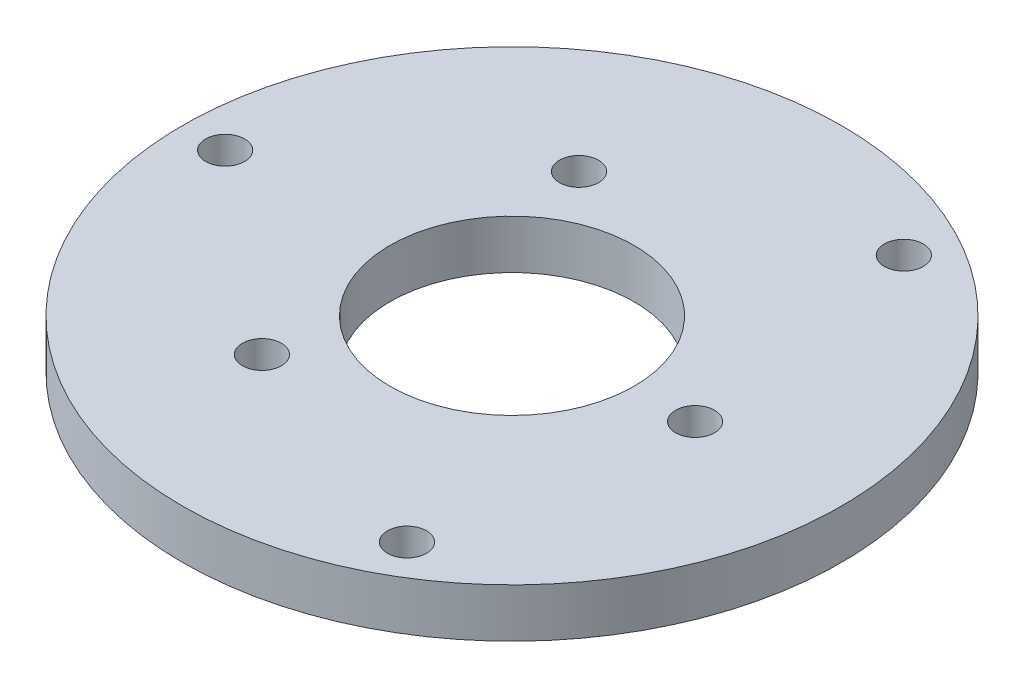
ISO-10303-21;
HEADER;
FILE_DESCRIPTION(('STEP AP214'),'2;1');
FILE_NAME('part.step','',(''),(''),'','','');
FILE_SCHEMA(('AUTOMOTIVE_DESIGN { 1 0 10303 214 1 1 1 1 }'));
ENDSEC;
DATA;
#1=APPLICATION_CONTEXT('core data for automotive mechanical design processes');
#2=APPLICATION_PROTOCOL_DEFINITION('international standard','automotive_design',2000,#1);
#3=PRODUCT_CONTEXT('',#1,'mechanical');
#4=PRODUCT('Part','Part','',(#3));
#5=PRODUCT_RELATED_PRODUCT_CATEGORY('part','',(#4));
#6=PRODUCT_DEFINITION_FORMATION('','',#4);
#7=PRODUCT_DEFINITION_CONTEXT('part definition',#1,'design');
#8=PRODUCT_DEFINITION('design','',#6,#7);
#9=PRODUCT_DEFINITION_SHAPE('','',#8);
#10=(LENGTH_UNIT() NAMED_UNIT(*) SI_UNIT(.MILLI.,.METRE.));
#11=(NAMED_UNIT(*) PLANE_ANGLE_UNIT() SI_UNIT($,.RADIAN.));
#12=(NAMED_UNIT(*) SI_UNIT($,.STERADIAN.) SOLID_ANGLE_UNIT());
#13=UNCERTAINTY_MEASURE_WITH_UNIT(LENGTH_MEASURE(1.E-05),#10,'distance_accuracy_value','');
#14=(GEOMETRIC_REPRESENTATION_CONTEXT(3) GLOBAL_UNCERTAINTY_ASSIGNED_CONTEXT((#13)) GLOBAL_UNIT_ASSIGNED_CONTEXT((#10,
#11,#12)) REPRESENTATION_CONTEXT('',''));
#15=CARTESIAN_POINT('',(0.,0.,0.));
#16=DIRECTION('',(0.,0.,1.));
#17=DIRECTION('',(1.,0.,0.));
#18=AXIS2_PLACEMENT_3D('',#15,#16,#17);
#19=CARTESIAN_POINT('',(0.,4.,0.));
#20=DIRECTION('',(0.,1.,0.));
#21=DIRECTION('',(0.,0.,1.));
#22=AXIS2_PLACEMENT_3D('',#19,#20,#21);
#23=PLANE('',#22);
#24=CARTESIAN_POINT('',(11.75,4.,-20.3515969889343));
#25=DIRECTION('',(0.,1.,0.));
#26=DIRECTION('',(0.,0.,1.));
#27=AXIS2_PLACEMENT_3D('',#24,#25,#26);
#28=CIRCLE('',#27,1.6);
#29=CARTESIAN_POINT('',(11.75,4.,-18.7515969889343));
#30=VERTEX_POINT('',#29);
#31=EDGE_CURVE('E55',#30,#30,#28,.T.);
#32=ORIENTED_EDGE('',*,*,#31,.F.);
#33=EDGE_LOOP('',(#32));
#34=FACE_BOUND('',#33,.T.);
#35=CARTESIAN_POINT('',(11.75,4.,20.3515969889343));
#36=DIRECTION('',(0.,1.,0.));
#37=DIRECTION('',(0.,0.,1.));
#38=AXIS2_PLACEMENT_3D('',#35,#36,#37);
#39=CIRCLE('',#38,1.6);
#40=CARTESIAN_POINT('',(11.75,4.,21.9515969889343));
#41=VERTEX_POINT('',#40);
#42=EDGE_CURVE('E116',#41,#41,#39,.T.);
#43=ORIENTED_EDGE('',*,*,#42,.F.);
#44=EDGE_LOOP('',(#43));
#45=FACE_BOUND('',#44,.T.);
#46=CARTESIAN_POINT('',(-23.5,4.,0.));
#47=DIRECTION('',(0.,1.,0.));
#48=DIRECTION('',(0.,0.,1.));
#49=AXIS2_PLACEMENT_3D('',#46,#47,#48);
#50=CIRCLE('',#49,1.6);
#51=CARTESIAN_POINT('',(-23.5,4.,1.60000000000001));
#52=VERTEX_POINT('',#51);
#53=EDGE_CURVE('E120',#52,#52,#50,.T.);
#54=ORIENTED_EDGE('',*,*,#53,.F.);
#55=EDGE_LOOP('',(#54));
#56=FACE_BOUND('',#55,.T.);
#57=CARTESIAN_POINT('',(-7.5,4.,12.9903810567666));
#58=DIRECTION('',(0.,1.,0.));
#59=DIRECTION('',(0.,0.,1.));
#60=AXIS2_PLACEMENT_3D('',#57,#58,#59);
#61=CIRCLE('',#60,1.6);
#62=CARTESIAN_POINT('',(-7.5,4.,14.5903810567666));
#63=VERTEX_POINT('',#62);
#64=EDGE_CURVE('E73',#63,#63,#61,.T.);
#65=ORIENTED_EDGE('',*,*,#64,.F.);
#66=EDGE_LOOP('',(#65));
#67=FACE_BOUND('',#66,.T.);
#68=CARTESIAN_POINT('',(0.,4.,0.));
#69=DIRECTION('',(0.,1.,0.));
#70=DIRECTION('',(0.,0.,1.));
#71=AXIS2_PLACEMENT_3D('',#68,#69,#70);
#72=CIRCLE('',#71,10.);
#73=CARTESIAN_POINT('',(0.,4.,10.));
#74=VERTEX_POINT('',#73);
#75=EDGE_CURVE('E46',#74,#74,#72,.T.);
#76=ORIENTED_EDGE('',*,*,#75,.F.);
#77=EDGE_LOOP('',(#76));
#78=FACE_BOUND('',#77,.T.);
#79=CARTESIAN_POINT('',(0.,4.,0.));
#80=DIRECTION('',(0.,1.,0.));
#81=DIRECTION('',(0.,0.,1.));
#82=AXIS2_PLACEMENT_3D('',#79,#80,#81);
#83=CIRCLE('',#82,27.);
#84=CARTESIAN_POINT('',(0.,4.,27.));
#85=VERTEX_POINT('',#84);
#86=EDGE_CURVE('E10',#85,#85,#83,.T.);
#87=ORIENTED_EDGE('',*,*,#86,.T.);
#88=EDGE_LOOP('',(#87));
#89=FACE_BOUND('',#88,.T.);
#90=CARTESIAN_POINT('',(15.,4.,0.));
#91=DIRECTION('',(0.,1.,0.));
#92=DIRECTION('',(0.,0.,1.));
#93=AXIS2_PLACEMENT_3D('',#90,#91,#92);
#94=CIRCLE('',#93,1.6);
#95=CARTESIAN_POINT('',(15.,4.,1.6));
#96=VERTEX_POINT('',#95);
#97=EDGE_CURVE('E79',#96,#96,#94,.T.);
#98=ORIENTED_EDGE('',*,*,#97,.F.);
#99=EDGE_LOOP('',(#98));
#100=FACE_BOUND('',#99,.T.);
#101=CARTESIAN_POINT('',(-7.5,4.,-12.9903810567666));
#102=DIRECTION('',(0.,1.,0.));
#103=DIRECTION('',(0.,0.,1.));
#104=AXIS2_PLACEMENT_3D('',#101,#102,#103);
#105=CIRCLE('',#104,1.6);
#106=CARTESIAN_POINT('',(-7.5,4.,-11.3903810567666));
#107=VERTEX_POINT('',#106);
#108=EDGE_CURVE('E64',#107,#107,#105,.T.);
#109=ORIENTED_EDGE('',*,*,#108,.F.);
#110=EDGE_LOOP('',(#109));
#111=FACE_BOUND('',#110,.T.);
#112=ADVANCED_FACE('F33',(#34,#45,#56,#67,#78,#89,#100,#111),#23,.T.);
#113=CARTESIAN_POINT('',(0.,0.,0.));
#114=DIRECTION('',(0.,1.,0.));
#115=DIRECTION('',(0.,0.,1.));
#116=AXIS2_PLACEMENT_3D('',#113,#114,#115);
#117=PLANE('',#116);
#118=CARTESIAN_POINT('',(11.75,0.,-20.3515969889343));
#119=DIRECTION('',(0.,1.,0.));
#120=DIRECTION('',(0.,0.,1.));
#121=AXIS2_PLACEMENT_3D('',#118,#119,#120);
#122=CIRCLE('',#121,1.6);
#123=CARTESIAN_POINT('',(11.75,0.,-18.7515969889343));
#124=VERTEX_POINT('',#123);
#125=EDGE_CURVE('E37',#124,#124,#122,.T.);
#126=ORIENTED_EDGE('',*,*,#125,.T.);
#127=EDGE_LOOP('',(#126));
#128=FACE_BOUND('',#127,.T.);
#129=CARTESIAN_POINT('',(11.75,0.,20.3515969889343));
#130=DIRECTION('',(0.,1.,0.));
#131=DIRECTION('',(0.,0.,1.));
#132=AXIS2_PLACEMENT_3D('',#129,#130,#131);
#133=CIRCLE('',#132,1.6);
#134=CARTESIAN_POINT('',(11.75,0.,21.9515969889343));
#135=VERTEX_POINT('',#134);
#136=EDGE_CURVE('E54',#135,#135,#133,.T.);
#137=ORIENTED_EDGE('',*,*,#136,.T.);
#138=EDGE_LOOP('',(#137));
#139=FACE_BOUND('',#138,.T.);
#140=CARTESIAN_POINT('',(-23.5,0.,0.));
#141=DIRECTION('',(0.,1.,0.));
#142=DIRECTION('',(0.,0.,1.));
#143=AXIS2_PLACEMENT_3D('',#140,#141,#142);
#144=CIRCLE('',#143,1.6);
#145=CARTESIAN_POINT('',(-23.5,0.,1.60000000000001));
#146=VERTEX_POINT('',#145);
#147=EDGE_CURVE('E52',#146,#146,#144,.T.);
#148=ORIENTED_EDGE('',*,*,#147,.T.);
#149=EDGE_LOOP('',(#148));
#150=FACE_BOUND('',#149,.T.);
#151=CARTESIAN_POINT('',(0.,0.,0.));
#152=DIRECTION('',(0.,1.,0.));
#153=DIRECTION('',(0.,0.,1.));
#154=AXIS2_PLACEMENT_3D('',#151,#152,#153);
#155=CIRCLE('',#154,27.);
#156=CARTESIAN_POINT('',(0.,0.,27.));
#157=VERTEX_POINT('',#156);
#158=EDGE_CURVE('E41',#157,#157,#155,.T.);
#159=ORIENTED_EDGE('',*,*,#158,.F.);
#160=EDGE_LOOP('',(#159));
#161=FACE_BOUND('',#160,.T.);
#162=CARTESIAN_POINT('',(0.,0.,0.));
#163=DIRECTION('',(0.,1.,0.));
#164=DIRECTION('',(0.,0.,1.));
#165=AXIS2_PLACEMENT_3D('',#162,#163,#164);
#166=CIRCLE('',#165,10.);
#167=CARTESIAN_POINT('',(0.,0.,10.));
#168=VERTEX_POINT('',#167);
#169=EDGE_CURVE('E49',#168,#168,#166,.T.);
#170=ORIENTED_EDGE('',*,*,#169,.T.);
#171=EDGE_LOOP('',(#170));
#172=FACE_BOUND('',#171,.T.);
#173=CARTESIAN_POINT('',(15.,0.,0.));
#174=DIRECTION('',(0.,1.,0.));
#175=DIRECTION('',(0.,0.,1.));
#176=AXIS2_PLACEMENT_3D('',#173,#174,#175);
#177=CIRCLE('',#176,1.6);
#178=CARTESIAN_POINT('',(15.,0.,1.6));
#179=VERTEX_POINT('',#178);
#180=EDGE_CURVE('E76',#179,#179,#177,.T.);
#181=ORIENTED_EDGE('',*,*,#180,.T.);
#182=EDGE_LOOP('',(#181));
#183=FACE_BOUND('',#182,.T.);
#184=CARTESIAN_POINT('',(-7.5,0.,12.9903810567666));
#185=DIRECTION('',(0.,1.,0.));
#186=DIRECTION('',(0.,0.,1.));
#187=AXIS2_PLACEMENT_3D('',#184,#185,#186);
#188=CIRCLE('',#187,1.6);
#189=CARTESIAN_POINT('',(-7.5,0.,14.5903810567666));
#190=VERTEX_POINT('',#189);
#191=EDGE_CURVE('E69',#190,#190,#188,.T.);
#192=ORIENTED_EDGE('',*,*,#191,.T.);
#193=EDGE_LOOP('',(#192));
#194=FACE_BOUND('',#193,.T.);
#195=CARTESIAN_POINT('',(-7.5,0.,-12.9903810567666));
#196=DIRECTION('',(0.,1.,0.));
#197=DIRECTION('',(0.,0.,1.));
#198=AXIS2_PLACEMENT_3D('',#195,#196,#197);
#199=CIRCLE('',#198,1.6);
#200=CARTESIAN_POINT('',(-7.5,0.,-11.3903810567666));
#201=VERTEX_POINT('',#200);
#202=EDGE_CURVE('E60',#201,#201,#199,.T.);
#203=ORIENTED_EDGE('',*,*,#202,.T.);
#204=EDGE_LOOP('',(#203));
#205=FACE_BOUND('',#204,.T.);
#206=ADVANCED_FACE('F89',(#128,#139,#150,#161,#172,#183,#194,#205),#117,.F.);
#207=CARTESIAN_POINT('',(0.,4.,0.));
#208=DIRECTION('',(0.,-1.,0.));
#209=DIRECTION('',(0.,0.,-1.));
#210=AXIS2_PLACEMENT_3D('',#207,#208,#209);
#211=CYLINDRICAL_SURFACE('',#210,27.);
#212=ORIENTED_EDGE('',*,*,#86,.F.);
#213=EDGE_LOOP('',(#212));
#214=FACE_BOUND('',#213,.T.);
#215=ORIENTED_EDGE('',*,*,#158,.T.);
#216=EDGE_LOOP('',(#215));
#217=FACE_BOUND('',#216,.T.);
#218=ADVANCED_FACE('F35',(#214,#217),#211,.T.);
#219=CARTESIAN_POINT('',(0.,4.,0.));
#220=DIRECTION('',(0.,-1.,0.));
#221=DIRECTION('',(0.,0.,-1.));
#222=AXIS2_PLACEMENT_3D('',#219,#220,#221);
#223=CYLINDRICAL_SURFACE('',#222,10.);
#224=ORIENTED_EDGE('',*,*,#75,.T.);
#225=EDGE_LOOP('',(#224));
#226=FACE_BOUND('',#225,.T.);
#227=ORIENTED_EDGE('',*,*,#169,.F.);
#228=EDGE_LOOP('',(#227));
#229=FACE_BOUND('',#228,.T.);
#230=ADVANCED_FACE('F92',(#226,#229),#223,.F.);
#231=CARTESIAN_POINT('',(15.,4.,0.));
#232=DIRECTION('',(0.,-1.,0.));
#233=DIRECTION('',(0.,0.,-1.));
#234=AXIS2_PLACEMENT_3D('',#231,#232,#233);
#235=CYLINDRICAL_SURFACE('',#234,1.6);
#236=ORIENTED_EDGE('',*,*,#97,.T.);
#237=EDGE_LOOP('',(#236));
#238=FACE_BOUND('',#237,.T.);
#239=ORIENTED_EDGE('',*,*,#180,.F.);
#240=EDGE_LOOP('',(#239));
#241=FACE_BOUND('',#240,.T.);
#242=ADVANCED_FACE('F94',(#238,#241),#235,.F.);
#243=CARTESIAN_POINT('',(-7.5,4.,12.9903810567666));
#244=DIRECTION('',(0.,-1.,0.));
#245=DIRECTION('',(0.,0.,-1.));
#246=AXIS2_PLACEMENT_3D('',#243,#244,#245);
#247=CYLINDRICAL_SURFACE('',#246,1.6);
#248=ORIENTED_EDGE('',*,*,#64,.T.);
#249=EDGE_LOOP('',(#248));
#250=FACE_BOUND('',#249,.T.);
#251=ORIENTED_EDGE('',*,*,#191,.F.);
#252=EDGE_LOOP('',(#251));
#253=FACE_BOUND('',#252,.T.);
#254=ADVANCED_FACE('F100',(#250,#253),#247,.F.);
#255=CARTESIAN_POINT('',(-7.5,4.,-12.9903810567666));
#256=DIRECTION('',(0.,-1.,0.));
#257=DIRECTION('',(0.,0.,-1.));
#258=AXIS2_PLACEMENT_3D('',#255,#256,#257);
#259=CYLINDRICAL_SURFACE('',#258,1.6);
#260=ORIENTED_EDGE('',*,*,#108,.T.);
#261=EDGE_LOOP('',(#260));
#262=FACE_BOUND('',#261,.T.);
#263=ORIENTED_EDGE('',*,*,#202,.F.);
#264=EDGE_LOOP('',(#263));
#265=FACE_BOUND('',#264,.T.);
#266=ADVANCED_FACE('F128',(#262,#265),#259,.F.);
#267=CARTESIAN_POINT('',(-23.5,-6.,0.));
#268=DIRECTION('',(0.,1.,0.));
#269=DIRECTION('',(0.,0.,1.));
#270=AXIS2_PLACEMENT_3D('',#267,#268,#269);
#271=CYLINDRICAL_SURFACE('',#270,1.6);
#272=ORIENTED_EDGE('',*,*,#53,.T.);
#273=EDGE_LOOP('',(#272));
#274=FACE_BOUND('',#273,.T.);
#275=ORIENTED_EDGE('',*,*,#147,.F.);
#276=EDGE_LOOP('',(#275));
#277=FACE_BOUND('',#276,.T.);
#278=ADVANCED_FACE('F131',(#274,#277),#271,.F.);
#279=CARTESIAN_POINT('',(11.75,-6.,20.3515969889343));
#280=DIRECTION('',(0.,1.,0.));
#281=DIRECTION('',(0.,0.,1.));
#282=AXIS2_PLACEMENT_3D('',#279,#280,#281);
#283=CYLINDRICAL_SURFACE('',#282,1.6);
#284=ORIENTED_EDGE('',*,*,#42,.T.);
#285=EDGE_LOOP('',(#284));
#286=FACE_BOUND('',#285,.T.);
#287=ORIENTED_EDGE('',*,*,#136,.F.);
#288=EDGE_LOOP('',(#287));
#289=FACE_BOUND('',#288,.T.);
#290=ADVANCED_FACE('F137',(#286,#289),#283,.F.);
#291=CARTESIAN_POINT('',(11.75,-6.,-20.3515969889343));
#292=DIRECTION('',(0.,1.,0.));
#293=DIRECTION('',(0.,0.,1.));
#294=AXIS2_PLACEMENT_3D('',#291,#292,#293);
#295=CYLINDRICAL_SURFACE('',#294,1.6);
#296=ORIENTED_EDGE('',*,*,#31,.T.);
#297=EDGE_LOOP('',(#296));
#298=FACE_BOUND('',#297,.T.);
#299=ORIENTED_EDGE('',*,*,#125,.F.);
#300=EDGE_LOOP('',(#299));
#301=FACE_BOUND('',#300,.T.);
#302=ADVANCED_FACE('F145',(#298,#301),#295,.F.);
#303=CLOSED_SHELL('',(#112,#206,#218,#230,#242,#254,#266,#278,#290,#302));
#304=MANIFOLD_SOLID_BREP('B2',#303);
#305=ADVANCED_BREP_SHAPE_REPRESENTATION('',(#18,#304),#14);
#306=SHAPE_DEFINITION_REPRESENTATION(#9,#305);
ENDSEC;
END-ISO-10303-21;
